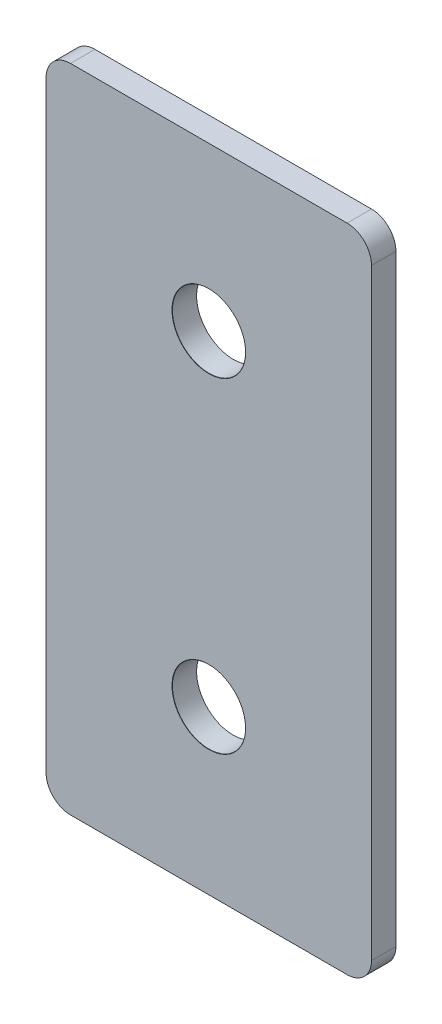
ISO-10303-21;
HEADER;
FILE_DESCRIPTION(('STEP AP214'),'2;1');
FILE_NAME('part.step','',(''),(''),'','','');
FILE_SCHEMA(('AUTOMOTIVE_DESIGN { 1 0 10303 214 1 1 1 1 }'));
ENDSEC;
DATA;
#1=APPLICATION_CONTEXT('core data for automotive mechanical design processes');
#2=APPLICATION_PROTOCOL_DEFINITION('international standard','automotive_design',2000,#1);
#3=PRODUCT_CONTEXT('',#1,'mechanical');
#4=PRODUCT('Part','Part','',(#3));
#5=PRODUCT_RELATED_PRODUCT_CATEGORY('part','',(#4));
#6=PRODUCT_DEFINITION_FORMATION('','',#4);
#7=PRODUCT_DEFINITION_CONTEXT('part definition',#1,'design');
#8=PRODUCT_DEFINITION('design','',#6,#7);
#9=PRODUCT_DEFINITION_SHAPE('','',#8);
#10=(LENGTH_UNIT() NAMED_UNIT(*) SI_UNIT(.MILLI.,.METRE.));
#11=(NAMED_UNIT(*) PLANE_ANGLE_UNIT() SI_UNIT($,.RADIAN.));
#12=(NAMED_UNIT(*) SI_UNIT($,.STERADIAN.) SOLID_ANGLE_UNIT());
#13=UNCERTAINTY_MEASURE_WITH_UNIT(LENGTH_MEASURE(1.E-05),#10,'distance_accuracy_value','');
#14=(GEOMETRIC_REPRESENTATION_CONTEXT(3) GLOBAL_UNCERTAINTY_ASSIGNED_CONTEXT((#13)) GLOBAL_UNIT_ASSIGNED_CONTEXT((#10,
#11,#12)) REPRESENTATION_CONTEXT('',''));
#15=CARTESIAN_POINT('',(0.,0.,0.));
#16=DIRECTION('',(0.,0.,1.));
#17=DIRECTION('',(1.,0.,0.));
#18=AXIS2_PLACEMENT_3D('',#15,#16,#17);
#19=CARTESIAN_POINT('',(20.,40.,-3.));
#20=DIRECTION('',(1.,0.,0.));
#21=DIRECTION('',(0.,0.,-1.));
#22=AXIS2_PLACEMENT_3D('',#19,#20,#21);
#23=PLANE('',#22);
#24=DIRECTION('',(0.,1.,0.));
#25=VECTOR('',#24,1.);
#26=CARTESIAN_POINT('',(20.,40.,0.));
#27=LINE('',#26,#25);
#28=CARTESIAN_POINT('',(20.,-37.,0.));
#29=VERTEX_POINT('',#28);
#30=CARTESIAN_POINT('',(20.,37.,0.));
#31=VERTEX_POINT('',#30);
#32=EDGE_CURVE('E167',#29,#31,#27,.T.);
#33=ORIENTED_EDGE('',*,*,#32,.F.);
#34=DIRECTION('',(0.,0.,1.));
#35=VECTOR('',#34,1.);
#36=CARTESIAN_POINT('',(20.,-37.,-3.));
#37=LINE('',#36,#35);
#38=CARTESIAN_POINT('',(20.,-37.,-3.));
#39=VERTEX_POINT('',#38);
#40=EDGE_CURVE('E155',#29,#39,#37,.F.);
#41=ORIENTED_EDGE('',*,*,#40,.T.);
#42=DIRECTION('',(0.,1.,0.));
#43=VECTOR('',#42,1.);
#44=CARTESIAN_POINT('',(20.,40.,-3.));
#45=LINE('',#44,#43);
#46=CARTESIAN_POINT('',(20.,37.,-3.));
#47=VERTEX_POINT('',#46);
#48=EDGE_CURVE('E132',#39,#47,#45,.T.);
#49=ORIENTED_EDGE('',*,*,#48,.T.);
#50=DIRECTION('',(0.,0.,1.));
#51=VECTOR('',#50,1.);
#52=CARTESIAN_POINT('',(20.,37.,-3.));
#53=LINE('',#52,#51);
#54=EDGE_CURVE('E149',#47,#31,#53,.T.);
#55=ORIENTED_EDGE('',*,*,#54,.T.);
#56=EDGE_LOOP('',(#33,#41,#49,#55));
#57=FACE_BOUND('',#56,.T.);
#58=ADVANCED_FACE('F42',(#57),#23,.T.);
#59=CARTESIAN_POINT('',(-20.,-40.,-3.));
#60=DIRECTION('',(0.,-1.,0.));
#61=DIRECTION('',(0.,0.,-1.));
#62=AXIS2_PLACEMENT_3D('',#59,#60,#61);
#63=PLANE('',#62);
#64=DIRECTION('',(1.,0.,0.));
#65=VECTOR('',#64,1.);
#66=CARTESIAN_POINT('',(-20.,-40.,-3.));
#67=LINE('',#66,#65);
#68=CARTESIAN_POINT('',(-17.,-40.,-3.));
#69=VERTEX_POINT('',#68);
#70=CARTESIAN_POINT('',(17.,-40.,-3.));
#71=VERTEX_POINT('',#70);
#72=EDGE_CURVE('E136',#69,#71,#67,.T.);
#73=ORIENTED_EDGE('',*,*,#72,.T.);
#74=DIRECTION('',(0.,0.,1.));
#75=VECTOR('',#74,1.);
#76=CARTESIAN_POINT('',(17.,-40.,-3.));
#77=LINE('',#76,#75);
#78=CARTESIAN_POINT('',(17.,-40.,0.));
#79=VERTEX_POINT('',#78);
#80=EDGE_CURVE('E134',#71,#79,#77,.T.);
#81=ORIENTED_EDGE('',*,*,#80,.T.);
#82=DIRECTION('',(1.,0.,0.));
#83=VECTOR('',#82,1.);
#84=CARTESIAN_POINT('',(-20.,-40.,0.));
#85=LINE('',#84,#83);
#86=CARTESIAN_POINT('',(-17.,-40.,0.));
#87=VERTEX_POINT('',#86);
#88=EDGE_CURVE('E113',#87,#79,#85,.T.);
#89=ORIENTED_EDGE('',*,*,#88,.F.);
#90=DIRECTION('',(0.,0.,1.));
#91=VECTOR('',#90,1.);
#92=CARTESIAN_POINT('',(-17.,-40.,-3.));
#93=LINE('',#92,#91);
#94=EDGE_CURVE('E129',#87,#69,#93,.F.);
#95=ORIENTED_EDGE('',*,*,#94,.T.);
#96=EDGE_LOOP('',(#73,#81,#89,#95));
#97=FACE_BOUND('',#96,.T.);
#98=ADVANCED_FACE('F126',(#97),#63,.T.);
#99=CARTESIAN_POINT('',(-20.,40.,-3.));
#100=DIRECTION('',(-1.,0.,0.));
#101=DIRECTION('',(0.,0.,1.));
#102=AXIS2_PLACEMENT_3D('',#99,#100,#101);
#103=PLANE('',#102);
#104=DIRECTION('',(0.,-1.,0.));
#105=VECTOR('',#104,1.);
#106=CARTESIAN_POINT('',(-20.,40.,-3.));
#107=LINE('',#106,#105);
#108=CARTESIAN_POINT('',(-20.,37.,-3.));
#109=VERTEX_POINT('',#108);
#110=CARTESIAN_POINT('',(-20.,-37.,-3.));
#111=VERTEX_POINT('',#110);
#112=EDGE_CURVE('E142',#109,#111,#107,.T.);
#113=ORIENTED_EDGE('',*,*,#112,.T.);
#114=DIRECTION('',(0.,0.,1.));
#115=VECTOR('',#114,1.);
#116=CARTESIAN_POINT('',(-20.,-37.,-3.));
#117=LINE('',#116,#115);
#118=CARTESIAN_POINT('',(-20.,-37.,0.));
#119=VERTEX_POINT('',#118);
#120=EDGE_CURVE('E165',#111,#119,#117,.T.);
#121=ORIENTED_EDGE('',*,*,#120,.T.);
#122=DIRECTION('',(0.,-1.,0.));
#123=VECTOR('',#122,1.);
#124=CARTESIAN_POINT('',(-20.,40.,0.));
#125=LINE('',#124,#123);
#126=CARTESIAN_POINT('',(-20.,37.,0.));
#127=VERTEX_POINT('',#126);
#128=EDGE_CURVE('E119',#127,#119,#125,.T.);
#129=ORIENTED_EDGE('',*,*,#128,.F.);
#130=DIRECTION('',(0.,0.,1.));
#131=VECTOR('',#130,1.);
#132=CARTESIAN_POINT('',(-20.,37.,-3.));
#133=LINE('',#132,#131);
#134=EDGE_CURVE('E159',#127,#109,#133,.F.);
#135=ORIENTED_EDGE('',*,*,#134,.T.);
#136=EDGE_LOOP('',(#113,#121,#129,#135));
#137=FACE_BOUND('',#136,.T.);
#138=ADVANCED_FACE('F201',(#137),#103,.T.);
#139=CARTESIAN_POINT('',(-20.,40.,-3.));
#140=DIRECTION('',(0.,1.,0.));
#141=DIRECTION('',(0.,0.,1.));
#142=AXIS2_PLACEMENT_3D('',#139,#140,#141);
#143=PLANE('',#142);
#144=DIRECTION('',(-1.,0.,0.));
#145=VECTOR('',#144,1.);
#146=CARTESIAN_POINT('',(-20.,40.,-3.));
#147=LINE('',#146,#145);
#148=CARTESIAN_POINT('',(17.,40.,-3.));
#149=VERTEX_POINT('',#148);
#150=CARTESIAN_POINT('',(-17.,40.,-3.));
#151=VERTEX_POINT('',#150);
#152=EDGE_CURVE('E184',#149,#151,#147,.T.);
#153=ORIENTED_EDGE('',*,*,#152,.T.);
#154=DIRECTION('',(0.,0.,1.));
#155=VECTOR('',#154,1.);
#156=CARTESIAN_POINT('',(-17.,40.,-3.));
#157=LINE('',#156,#155);
#158=CARTESIAN_POINT('',(-17.,40.,0.));
#159=VERTEX_POINT('',#158);
#160=EDGE_CURVE('E11',#151,#159,#157,.T.);
#161=ORIENTED_EDGE('',*,*,#160,.T.);
#162=DIRECTION('',(-1.,0.,0.));
#163=VECTOR('',#162,1.);
#164=CARTESIAN_POINT('',(-20.,40.,0.));
#165=LINE('',#164,#163);
#166=CARTESIAN_POINT('',(17.,40.,0.));
#167=VERTEX_POINT('',#166);
#168=EDGE_CURVE('E173',#167,#159,#165,.T.);
#169=ORIENTED_EDGE('',*,*,#168,.F.);
#170=DIRECTION('',(0.,0.,1.));
#171=VECTOR('',#170,1.);
#172=CARTESIAN_POINT('',(17.,40.,-3.));
#173=LINE('',#172,#171);
#174=EDGE_CURVE('E52',#167,#149,#173,.F.);
#175=ORIENTED_EDGE('',*,*,#174,.T.);
#176=EDGE_LOOP('',(#153,#161,#169,#175));
#177=FACE_BOUND('',#176,.T.);
#178=ADVANCED_FACE('F190',(#177),#143,.T.);
#179=CARTESIAN_POINT('',(0.,0.,-3.));
#180=DIRECTION('',(0.,0.,1.));
#181=DIRECTION('',(1.,0.,0.));
#182=AXIS2_PLACEMENT_3D('',#179,#180,#181);
#183=PLANE('',#182);
#184=CARTESIAN_POINT('',(0.,20.,-3.));
#185=DIRECTION('',(0.,0.,1.));
#186=DIRECTION('',(1.,0.,0.));
#187=AXIS2_PLACEMENT_3D('',#184,#185,#186);
#188=CIRCLE('',#187,4.5);
#189=CARTESIAN_POINT('',(4.5,20.,-3.));
#190=VERTEX_POINT('',#189);
#191=EDGE_CURVE('E48',#190,#190,#188,.T.);
#192=ORIENTED_EDGE('',*,*,#191,.T.);
#193=EDGE_LOOP('',(#192));
#194=FACE_BOUND('',#193,.T.);
#195=CARTESIAN_POINT('',(0.,-20.,-3.));
#196=DIRECTION('',(0.,0.,1.));
#197=DIRECTION('',(1.,0.,0.));
#198=AXIS2_PLACEMENT_3D('',#195,#196,#197);
#199=CIRCLE('',#198,4.5);
#200=CARTESIAN_POINT('',(4.5,-20.,-3.));
#201=VERTEX_POINT('',#200);
#202=EDGE_CURVE('E163',#201,#201,#199,.T.);
#203=ORIENTED_EDGE('',*,*,#202,.T.);
#204=EDGE_LOOP('',(#203));
#205=FACE_BOUND('',#204,.T.);
#206=ORIENTED_EDGE('',*,*,#48,.F.);
#207=CARTESIAN_POINT('',(17.,-37.,-3.));
#208=DIRECTION('',(0.,0.,1.));
#209=DIRECTION('',(1.,0.,0.));
#210=AXIS2_PLACEMENT_3D('',#207,#208,#209);
#211=CIRCLE('',#210,3.);
#212=EDGE_CURVE('E158',#39,#71,#211,.F.);
#213=ORIENTED_EDGE('',*,*,#212,.T.);
#214=ORIENTED_EDGE('',*,*,#72,.F.);
#215=CARTESIAN_POINT('',(-17.,-37.,-3.));
#216=DIRECTION('',(0.,0.,1.));
#217=DIRECTION('',(1.,0.,0.));
#218=AXIS2_PLACEMENT_3D('',#215,#216,#217);
#219=CIRCLE('',#218,3.);
#220=EDGE_CURVE('E140',#69,#111,#219,.F.);
#221=ORIENTED_EDGE('',*,*,#220,.T.);
#222=ORIENTED_EDGE('',*,*,#112,.F.);
#223=CARTESIAN_POINT('',(-17.,37.,-3.));
#224=DIRECTION('',(0.,0.,1.));
#225=DIRECTION('',(1.,0.,0.));
#226=AXIS2_PLACEMENT_3D('',#223,#224,#225);
#227=CIRCLE('',#226,3.);
#228=EDGE_CURVE('E63',#109,#151,#227,.F.);
#229=ORIENTED_EDGE('',*,*,#228,.T.);
#230=ORIENTED_EDGE('',*,*,#152,.F.);
#231=CARTESIAN_POINT('',(17.,37.,-3.));
#232=DIRECTION('',(0.,0.,1.));
#233=DIRECTION('',(1.,0.,0.));
#234=AXIS2_PLACEMENT_3D('',#231,#232,#233);
#235=CIRCLE('',#234,3.);
#236=EDGE_CURVE('E152',#149,#47,#235,.F.);
#237=ORIENTED_EDGE('',*,*,#236,.T.);
#238=EDGE_LOOP('',(#206,#213,#214,#221,#222,#229,#230,#237));
#239=FACE_BOUND('',#238,.T.);
#240=ADVANCED_FACE('F192',(#194,#205,#239),#183,.F.);
#241=CARTESIAN_POINT('',(0.,0.,0.));
#242=DIRECTION('',(0.,0.,1.));
#243=DIRECTION('',(1.,0.,0.));
#244=AXIS2_PLACEMENT_3D('',#241,#242,#243);
#245=PLANE('',#244);
#246=CARTESIAN_POINT('',(0.,20.,0.));
#247=DIRECTION('',(0.,0.,1.));
#248=DIRECTION('',(1.,0.,0.));
#249=AXIS2_PLACEMENT_3D('',#246,#247,#248);
#250=CIRCLE('',#249,4.525);
#251=CARTESIAN_POINT('',(4.525,20.,0.));
#252=VERTEX_POINT('',#251);
#253=EDGE_CURVE('E329',#252,#252,#250,.T.);
#254=ORIENTED_EDGE('',*,*,#253,.F.);
#255=EDGE_LOOP('',(#254));
#256=FACE_BOUND('',#255,.T.);
#257=CARTESIAN_POINT('',(0.,-20.,0.));
#258=DIRECTION('',(0.,0.,1.));
#259=DIRECTION('',(1.,0.,0.));
#260=AXIS2_PLACEMENT_3D('',#257,#258,#259);
#261=CIRCLE('',#260,4.525);
#262=CARTESIAN_POINT('',(4.525,-20.,0.));
#263=VERTEX_POINT('',#262);
#264=EDGE_CURVE('E175',#263,#263,#261,.T.);
#265=ORIENTED_EDGE('',*,*,#264,.F.);
#266=EDGE_LOOP('',(#265));
#267=FACE_BOUND('',#266,.T.);
#268=ORIENTED_EDGE('',*,*,#88,.T.);
#269=CARTESIAN_POINT('',(17.,-37.,0.));
#270=DIRECTION('',(0.,0.,1.));
#271=DIRECTION('',(1.,0.,0.));
#272=AXIS2_PLACEMENT_3D('',#269,#270,#271);
#273=CIRCLE('',#272,3.);
#274=EDGE_CURVE('E125',#79,#29,#273,.T.);
#275=ORIENTED_EDGE('',*,*,#274,.T.);
#276=ORIENTED_EDGE('',*,*,#32,.T.);
#277=CARTESIAN_POINT('',(17.,37.,0.));
#278=DIRECTION('',(0.,0.,1.));
#279=DIRECTION('',(1.,0.,0.));
#280=AXIS2_PLACEMENT_3D('',#277,#278,#279);
#281=CIRCLE('',#280,3.);
#282=EDGE_CURVE('E137',#31,#167,#281,.T.);
#283=ORIENTED_EDGE('',*,*,#282,.T.);
#284=ORIENTED_EDGE('',*,*,#168,.T.);
#285=CARTESIAN_POINT('',(-17.,37.,0.));
#286=DIRECTION('',(0.,0.,1.));
#287=DIRECTION('',(1.,0.,0.));
#288=AXIS2_PLACEMENT_3D('',#285,#286,#287);
#289=CIRCLE('',#288,3.);
#290=EDGE_CURVE('E121',#159,#127,#289,.T.);
#291=ORIENTED_EDGE('',*,*,#290,.T.);
#292=ORIENTED_EDGE('',*,*,#128,.T.);
#293=CARTESIAN_POINT('',(-17.,-37.,0.));
#294=DIRECTION('',(0.,0.,1.));
#295=DIRECTION('',(1.,0.,0.));
#296=AXIS2_PLACEMENT_3D('',#293,#294,#295);
#297=CIRCLE('',#296,3.);
#298=EDGE_CURVE('E115',#119,#87,#297,.T.);
#299=ORIENTED_EDGE('',*,*,#298,.T.);
#300=EDGE_LOOP('',(#268,#275,#276,#283,#284,#291,#292,#299));
#301=FACE_BOUND('',#300,.T.);
#302=ADVANCED_FACE('F111',(#256,#267,#301),#245,.T.);
#303=CARTESIAN_POINT('',(17.,-37.,-3.));
#304=DIRECTION('',(0.,0.,1.));
#305=DIRECTION('',(1.,0.,0.));
#306=AXIS2_PLACEMENT_3D('',#303,#304,#305);
#307=CYLINDRICAL_SURFACE('',#306,3.);
#308=ORIENTED_EDGE('',*,*,#212,.F.);
#309=ORIENTED_EDGE('',*,*,#40,.F.);
#310=ORIENTED_EDGE('',*,*,#274,.F.);
#311=ORIENTED_EDGE('',*,*,#80,.F.);
#312=EDGE_LOOP('',(#308,#309,#310,#311));
#313=FACE_BOUND('',#312,.T.);
#314=ADVANCED_FACE('F203',(#313),#307,.T.);
#315=CARTESIAN_POINT('',(-17.,-37.,-3.));
#316=DIRECTION('',(0.,0.,1.));
#317=DIRECTION('',(1.,0.,0.));
#318=AXIS2_PLACEMENT_3D('',#315,#316,#317);
#319=CYLINDRICAL_SURFACE('',#318,3.);
#320=ORIENTED_EDGE('',*,*,#220,.F.);
#321=ORIENTED_EDGE('',*,*,#94,.F.);
#322=ORIENTED_EDGE('',*,*,#298,.F.);
#323=ORIENTED_EDGE('',*,*,#120,.F.);
#324=EDGE_LOOP('',(#320,#321,#322,#323));
#325=FACE_BOUND('',#324,.T.);
#326=ADVANCED_FACE('F138',(#325),#319,.T.);
#327=CARTESIAN_POINT('',(-17.,37.,-3.));
#328=DIRECTION('',(0.,0.,1.));
#329=DIRECTION('',(1.,0.,0.));
#330=AXIS2_PLACEMENT_3D('',#327,#328,#329);
#331=CYLINDRICAL_SURFACE('',#330,3.);
#332=ORIENTED_EDGE('',*,*,#228,.F.);
#333=ORIENTED_EDGE('',*,*,#134,.F.);
#334=ORIENTED_EDGE('',*,*,#290,.F.);
#335=ORIENTED_EDGE('',*,*,#160,.F.);
#336=EDGE_LOOP('',(#332,#333,#334,#335));
#337=FACE_BOUND('',#336,.T.);
#338=ADVANCED_FACE('F206',(#337),#331,.T.);
#339=CARTESIAN_POINT('',(17.,37.,-3.));
#340=DIRECTION('',(0.,0.,1.));
#341=DIRECTION('',(1.,0.,0.));
#342=AXIS2_PLACEMENT_3D('',#339,#340,#341);
#343=CYLINDRICAL_SURFACE('',#342,3.);
#344=ORIENTED_EDGE('',*,*,#236,.F.);
#345=ORIENTED_EDGE('',*,*,#174,.F.);
#346=ORIENTED_EDGE('',*,*,#282,.F.);
#347=ORIENTED_EDGE('',*,*,#54,.F.);
#348=EDGE_LOOP('',(#344,#345,#346,#347));
#349=FACE_BOUND('',#348,.T.);
#350=ADVANCED_FACE('F46',(#349),#343,.T.);
#351=CARTESIAN_POINT('',(0.,-20.,0.));
#352=DIRECTION('',(0.,0.,1.));
#353=DIRECTION('',(1.,0.,0.));
#354=AXIS2_PLACEMENT_3D('',#351,#352,#353);
#355=CYLINDRICAL_SURFACE('',#354,4.5);
#356=CARTESIAN_POINT('',(0.,-20.,-0.0250000000000059));
#357=DIRECTION('',(0.,0.,1.));
#358=DIRECTION('',(1.,0.,0.));
#359=AXIS2_PLACEMENT_3D('',#356,#357,#358);
#360=CIRCLE('',#359,4.5);
#361=CARTESIAN_POINT('',(4.5,-20.,-0.0250000000000059));
#362=VERTEX_POINT('',#361);
#363=EDGE_CURVE('E170',#362,#362,#360,.T.);
#364=ORIENTED_EDGE('',*,*,#363,.T.);
#365=EDGE_LOOP('',(#364));
#366=FACE_BOUND('',#365,.T.);
#367=ORIENTED_EDGE('',*,*,#202,.F.);
#368=EDGE_LOOP('',(#367));
#369=FACE_BOUND('',#368,.T.);
#370=ADVANCED_FACE('F215',(#366,#369),#355,.F.);
#371=CARTESIAN_POINT('',(0.,-20.,0.));
#372=DIRECTION('',(0.,0.,1.));
#373=DIRECTION('',(1.,0.,0.));
#374=AXIS2_PLACEMENT_3D('',#371,#372,#373);
#375=CONICAL_SURFACE('',#374,4.525,0.785398163397379);
#376=ORIENTED_EDGE('',*,*,#363,.F.);
#377=EDGE_LOOP('',(#376));
#378=FACE_BOUND('',#377,.T.);
#379=ORIENTED_EDGE('',*,*,#264,.T.);
#380=EDGE_LOOP('',(#379));
#381=FACE_BOUND('',#380,.T.);
#382=ADVANCED_FACE('F294',(#378,#381),#375,.F.);
#383=CARTESIAN_POINT('',(0.,20.,0.));
#384=DIRECTION('',(0.,0.,1.));
#385=DIRECTION('',(1.,0.,0.));
#386=AXIS2_PLACEMENT_3D('',#383,#384,#385);
#387=CYLINDRICAL_SURFACE('',#386,4.5);
#388=CARTESIAN_POINT('',(0.,20.,-0.0250000000000059));
#389=DIRECTION('',(0.,0.,1.));
#390=DIRECTION('',(1.,0.,0.));
#391=AXIS2_PLACEMENT_3D('',#388,#389,#390);
#392=CIRCLE('',#391,4.5);
#393=CARTESIAN_POINT('',(4.5,20.,-0.0250000000000059));
#394=VERTEX_POINT('',#393);
#395=EDGE_CURVE('E327',#394,#394,#392,.T.);
#396=ORIENTED_EDGE('',*,*,#395,.T.);
#397=EDGE_LOOP('',(#396));
#398=FACE_BOUND('',#397,.T.);
#399=ORIENTED_EDGE('',*,*,#191,.F.);
#400=EDGE_LOOP('',(#399));
#401=FACE_BOUND('',#400,.T.);
#402=ADVANCED_FACE('F305',(#398,#401),#387,.F.);
#403=CARTESIAN_POINT('',(0.,20.,0.));
#404=DIRECTION('',(0.,0.,1.));
#405=DIRECTION('',(1.,0.,0.));
#406=AXIS2_PLACEMENT_3D('',#403,#404,#405);
#407=CONICAL_SURFACE('',#406,4.525,0.785398163397379);
#408=ORIENTED_EDGE('',*,*,#395,.F.);
#409=EDGE_LOOP('',(#408));
#410=FACE_BOUND('',#409,.T.);
#411=ORIENTED_EDGE('',*,*,#253,.T.);
#412=EDGE_LOOP('',(#411));
#413=FACE_BOUND('',#412,.T.);
#414=ADVANCED_FACE('F315',(#410,#413),#407,.F.);
#415=CLOSED_SHELL('',(#58,#98,#138,#178,#240,#302,#314,#326,#338,#350,#370,#382,#402,#414));
#416=MANIFOLD_SOLID_BREP('B2',#415);
#417=ADVANCED_BREP_SHAPE_REPRESENTATION('',(#18,#416),#14);
#418=SHAPE_DEFINITION_REPRESENTATION(#9,#417);
ENDSEC;
END-ISO-10303-21;
